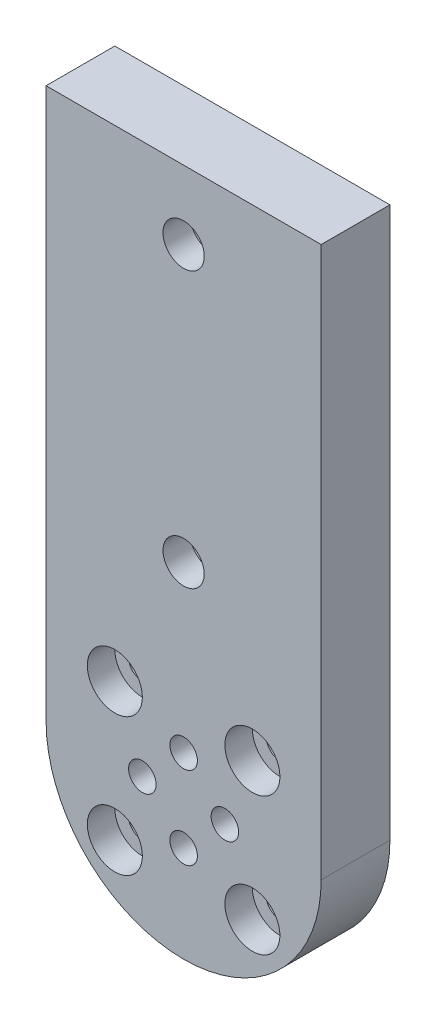
ISO-10303-21;
HEADER;
FILE_DESCRIPTION(('STEP AP214'),'2;1');
FILE_NAME('part.step','',(''),(''),'','','');
FILE_SCHEMA(('AUTOMOTIVE_DESIGN { 1 0 10303 214 1 1 1 1 }'));
ENDSEC;
DATA;
#1=APPLICATION_CONTEXT('core data for automotive mechanical design processes');
#2=APPLICATION_PROTOCOL_DEFINITION('international standard','automotive_design',2000,#1);
#3=PRODUCT_CONTEXT('',#1,'mechanical');
#4=PRODUCT('Part','Part','',(#3));
#5=PRODUCT_RELATED_PRODUCT_CATEGORY('part','',(#4));
#6=PRODUCT_DEFINITION_FORMATION('','',#4);
#7=PRODUCT_DEFINITION_CONTEXT('part definition',#1,'design');
#8=PRODUCT_DEFINITION('design','',#6,#7);
#9=PRODUCT_DEFINITION_SHAPE('','',#8);
#10=(LENGTH_UNIT() NAMED_UNIT(*) SI_UNIT(.MILLI.,.METRE.));
#11=(NAMED_UNIT(*) PLANE_ANGLE_UNIT() SI_UNIT($,.RADIAN.));
#12=(NAMED_UNIT(*) SI_UNIT($,.STERADIAN.) SOLID_ANGLE_UNIT());
#13=UNCERTAINTY_MEASURE_WITH_UNIT(LENGTH_MEASURE(1.E-05),#10,'distance_accuracy_value','');
#14=(GEOMETRIC_REPRESENTATION_CONTEXT(3) GLOBAL_UNCERTAINTY_ASSIGNED_CONTEXT((#13)) GLOBAL_UNIT_ASSIGNED_CONTEXT((#10,
#11,#12)) REPRESENTATION_CONTEXT('',''));
#15=CARTESIAN_POINT('',(0.,0.,0.));
#16=DIRECTION('',(0.,0.,1.));
#17=DIRECTION('',(1.,0.,0.));
#18=AXIS2_PLACEMENT_3D('',#15,#16,#17);
#19=CARTESIAN_POINT('',(0.,15.,5.));
#20=DIRECTION('',(0.,0.,-1.));
#21=DIRECTION('',(-1.,0.,0.));
#22=AXIS2_PLACEMENT_3D('',#19,#20,#21);
#23=CYLINDRICAL_SURFACE('',#22,1.5);
#24=CARTESIAN_POINT('',(0.,15.,5.));
#25=DIRECTION('',(0.,0.,1.));
#26=DIRECTION('',(1.,0.,0.));
#27=AXIS2_PLACEMENT_3D('',#24,#25,#26);
#28=CIRCLE('',#27,1.5);
#29=CARTESIAN_POINT('',(1.5,15.,5.));
#30=VERTEX_POINT('',#29);
#31=EDGE_CURVE('E105',#30,#30,#28,.T.);
#32=ORIENTED_EDGE('',*,*,#31,.T.);
#33=EDGE_LOOP('',(#32));
#34=FACE_BOUND('',#33,.T.);
#35=CARTESIAN_POINT('',(0.,15.,3.));
#36=DIRECTION('',(0.,0.,-1.));
#37=DIRECTION('',(-1.,0.,0.));
#38=AXIS2_PLACEMENT_3D('',#35,#36,#37);
#39=CIRCLE('',#38,1.5);
#40=CARTESIAN_POINT('',(-1.5,15.,3.));
#41=VERTEX_POINT('',#40);
#42=EDGE_CURVE('E44',#41,#41,#39,.T.);
#43=ORIENTED_EDGE('',*,*,#42,.T.);
#44=EDGE_LOOP('',(#43));
#45=FACE_BOUND('',#44,.T.);
#46=ADVANCED_FACE('F40',(#34,#45),#23,.F.);
#47=CARTESIAN_POINT('',(0.,35.,5.));
#48=DIRECTION('',(0.,0.,-1.));
#49=DIRECTION('',(-1.,0.,0.));
#50=AXIS2_PLACEMENT_3D('',#47,#48,#49);
#51=CYLINDRICAL_SURFACE('',#50,1.5);
#52=CARTESIAN_POINT('',(0.,35.,5.));
#53=DIRECTION('',(0.,0.,1.));
#54=DIRECTION('',(1.,0.,0.));
#55=AXIS2_PLACEMENT_3D('',#52,#53,#54);
#56=CIRCLE('',#55,1.5);
#57=CARTESIAN_POINT('',(1.5,35.,5.));
#58=VERTEX_POINT('',#57);
#59=EDGE_CURVE('E111',#58,#58,#56,.T.);
#60=ORIENTED_EDGE('',*,*,#59,.T.);
#61=EDGE_LOOP('',(#60));
#62=FACE_BOUND('',#61,.T.);
#63=CARTESIAN_POINT('',(0.,35.,3.));
#64=DIRECTION('',(0.,0.,-1.));
#65=DIRECTION('',(-1.,0.,0.));
#66=AXIS2_PLACEMENT_3D('',#63,#64,#65);
#67=CIRCLE('',#66,1.5);
#68=CARTESIAN_POINT('',(-1.5,35.,3.));
#69=VERTEX_POINT('',#68);
#70=EDGE_CURVE('E148',#69,#69,#67,.T.);
#71=ORIENTED_EDGE('',*,*,#70,.T.);
#72=EDGE_LOOP('',(#71));
#73=FACE_BOUND('',#72,.T.);
#74=ADVANCED_FACE('F234',(#62,#73),#51,.F.);
#75=CARTESIAN_POINT('',(-5.,5.,5.));
#76=DIRECTION('',(0.,0.,-1.));
#77=DIRECTION('',(-1.,0.,0.));
#78=AXIS2_PLACEMENT_3D('',#75,#76,#77);
#79=CYLINDRICAL_SURFACE('',#78,1.);
#80=CARTESIAN_POINT('',(-5.,5.,0.));
#81=DIRECTION('',(0.,0.,1.));
#82=DIRECTION('',(1.,0.,0.));
#83=AXIS2_PLACEMENT_3D('',#80,#81,#82);
#84=CIRCLE('',#83,1.);
#85=CARTESIAN_POINT('',(-4.,5.,0.));
#86=VERTEX_POINT('',#85);
#87=EDGE_CURVE('E124',#86,#86,#84,.T.);
#88=ORIENTED_EDGE('',*,*,#87,.F.);
#89=EDGE_LOOP('',(#88));
#90=FACE_BOUND('',#89,.T.);
#91=CARTESIAN_POINT('',(-5.,5.,3.));
#92=DIRECTION('',(0.,0.,1.));
#93=DIRECTION('',(1.,0.,0.));
#94=AXIS2_PLACEMENT_3D('',#91,#92,#93);
#95=CIRCLE('',#94,1.);
#96=CARTESIAN_POINT('',(-4.,5.,3.));
#97=VERTEX_POINT('',#96);
#98=EDGE_CURVE('E118',#97,#97,#95,.T.);
#99=ORIENTED_EDGE('',*,*,#98,.T.);
#100=EDGE_LOOP('',(#99));
#101=FACE_BOUND('',#100,.T.);
#102=ADVANCED_FACE('F240',(#90,#101),#79,.F.);
#103=CARTESIAN_POINT('',(5.,5.,5.));
#104=DIRECTION('',(0.,0.,-1.));
#105=DIRECTION('',(-1.,0.,0.));
#106=AXIS2_PLACEMENT_3D('',#103,#104,#105);
#107=CYLINDRICAL_SURFACE('',#106,1.);
#108=CARTESIAN_POINT('',(5.,5.,0.));
#109=DIRECTION('',(0.,0.,1.));
#110=DIRECTION('',(1.,0.,0.));
#111=AXIS2_PLACEMENT_3D('',#108,#109,#110);
#112=CIRCLE('',#111,1.);
#113=CARTESIAN_POINT('',(6.,5.,0.));
#114=VERTEX_POINT('',#113);
#115=EDGE_CURVE('E121',#114,#114,#112,.T.);
#116=ORIENTED_EDGE('',*,*,#115,.F.);
#117=EDGE_LOOP('',(#116));
#118=FACE_BOUND('',#117,.T.);
#119=CARTESIAN_POINT('',(5.,5.,3.));
#120=DIRECTION('',(0.,0.,1.));
#121=DIRECTION('',(1.,0.,0.));
#122=AXIS2_PLACEMENT_3D('',#119,#120,#121);
#123=CIRCLE('',#122,1.);
#124=CARTESIAN_POINT('',(6.,5.,3.));
#125=VERTEX_POINT('',#124);
#126=EDGE_CURVE('E144',#125,#125,#123,.T.);
#127=ORIENTED_EDGE('',*,*,#126,.T.);
#128=EDGE_LOOP('',(#127));
#129=FACE_BOUND('',#128,.T.);
#130=ADVANCED_FACE('F254',(#118,#129),#107,.F.);
#131=CARTESIAN_POINT('',(-5.,-5.,5.));
#132=DIRECTION('',(0.,0.,-1.));
#133=DIRECTION('',(-1.,0.,0.));
#134=AXIS2_PLACEMENT_3D('',#131,#132,#133);
#135=CYLINDRICAL_SURFACE('',#134,1.);
#136=CARTESIAN_POINT('',(-5.,-5.,0.));
#137=DIRECTION('',(0.,0.,1.));
#138=DIRECTION('',(1.,0.,0.));
#139=AXIS2_PLACEMENT_3D('',#136,#137,#138);
#140=CIRCLE('',#139,1.);
#141=CARTESIAN_POINT('',(-4.,-5.,0.));
#142=VERTEX_POINT('',#141);
#143=EDGE_CURVE('E117',#142,#142,#140,.T.);
#144=ORIENTED_EDGE('',*,*,#143,.F.);
#145=EDGE_LOOP('',(#144));
#146=FACE_BOUND('',#145,.T.);
#147=CARTESIAN_POINT('',(-5.,-5.,3.));
#148=DIRECTION('',(0.,0.,1.));
#149=DIRECTION('',(1.,0.,0.));
#150=AXIS2_PLACEMENT_3D('',#147,#148,#149);
#151=CIRCLE('',#150,1.);
#152=CARTESIAN_POINT('',(-4.,-5.,3.));
#153=VERTEX_POINT('',#152);
#154=EDGE_CURVE('E140',#153,#153,#151,.T.);
#155=ORIENTED_EDGE('',*,*,#154,.T.);
#156=EDGE_LOOP('',(#155));
#157=FACE_BOUND('',#156,.T.);
#158=ADVANCED_FACE('F257',(#146,#157),#135,.F.);
#159=CARTESIAN_POINT('',(5.,-5.,5.));
#160=DIRECTION('',(0.,0.,-1.));
#161=DIRECTION('',(-1.,0.,0.));
#162=AXIS2_PLACEMENT_3D('',#159,#160,#161);
#163=CYLINDRICAL_SURFACE('',#162,1.);
#164=CARTESIAN_POINT('',(5.,-5.,0.));
#165=DIRECTION('',(0.,0.,1.));
#166=DIRECTION('',(1.,0.,0.));
#167=AXIS2_PLACEMENT_3D('',#164,#165,#166);
#168=CIRCLE('',#167,1.);
#169=CARTESIAN_POINT('',(6.,-5.,0.));
#170=VERTEX_POINT('',#169);
#171=EDGE_CURVE('E114',#170,#170,#168,.T.);
#172=ORIENTED_EDGE('',*,*,#171,.F.);
#173=EDGE_LOOP('',(#172));
#174=FACE_BOUND('',#173,.T.);
#175=CARTESIAN_POINT('',(5.,-5.,3.));
#176=DIRECTION('',(0.,0.,1.));
#177=DIRECTION('',(1.,0.,0.));
#178=AXIS2_PLACEMENT_3D('',#175,#176,#177);
#179=CIRCLE('',#178,1.);
#180=CARTESIAN_POINT('',(6.,-5.,3.));
#181=VERTEX_POINT('',#180);
#182=EDGE_CURVE('E137',#181,#181,#179,.T.);
#183=ORIENTED_EDGE('',*,*,#182,.T.);
#184=EDGE_LOOP('',(#183));
#185=FACE_BOUND('',#184,.T.);
#186=ADVANCED_FACE('F42',(#174,#185),#163,.F.);
#187=CARTESIAN_POINT('',(0.,0.,5.));
#188=DIRECTION('',(0.,0.,-1.));
#189=DIRECTION('',(-1.,0.,0.));
#190=AXIS2_PLACEMENT_3D('',#187,#188,#189);
#191=CYLINDRICAL_SURFACE('',#190,10.);
#192=CARTESIAN_POINT('',(0.,0.,0.));
#193=DIRECTION('',(0.,0.,1.));
#194=DIRECTION('',(1.,0.,0.));
#195=AXIS2_PLACEMENT_3D('',#192,#193,#194);
#196=CIRCLE('',#195,10.);
#197=CARTESIAN_POINT('',(-10.,0.,0.));
#198=VERTEX_POINT('',#197);
#199=CARTESIAN_POINT('',(10.,0.,0.));
#200=VERTEX_POINT('',#199);
#201=EDGE_CURVE('E127',#198,#200,#196,.T.);
#202=ORIENTED_EDGE('',*,*,#201,.T.);
#203=DIRECTION('',(0.,0.,-1.));
#204=VECTOR('',#203,1.);
#205=CARTESIAN_POINT('',(10.,0.,5.));
#206=LINE('',#205,#204);
#207=CARTESIAN_POINT('',(10.,0.,5.));
#208=VERTEX_POINT('',#207);
#209=EDGE_CURVE('E11',#208,#200,#206,.T.);
#210=ORIENTED_EDGE('',*,*,#209,.F.);
#211=CARTESIAN_POINT('',(0.,0.,5.));
#212=DIRECTION('',(0.,0.,1.));
#213=DIRECTION('',(1.,0.,0.));
#214=AXIS2_PLACEMENT_3D('',#211,#212,#213);
#215=CIRCLE('',#214,10.);
#216=CARTESIAN_POINT('',(-10.,0.,5.));
#217=VERTEX_POINT('',#216);
#218=EDGE_CURVE('E93',#217,#208,#215,.T.);
#219=ORIENTED_EDGE('',*,*,#218,.F.);
#220=DIRECTION('',(0.,0.,-1.));
#221=VECTOR('',#220,1.);
#222=CARTESIAN_POINT('',(-10.,0.,5.));
#223=LINE('',#222,#221);
#224=EDGE_CURVE('E59',#217,#198,#223,.T.);
#225=ORIENTED_EDGE('',*,*,#224,.T.);
#226=EDGE_LOOP('',(#202,#210,#219,#225));
#227=FACE_BOUND('',#226,.T.);
#228=ADVANCED_FACE('F249',(#227),#191,.T.);
#229=CARTESIAN_POINT('',(10.,0.,5.));
#230=DIRECTION('',(-1.,0.,0.));
#231=DIRECTION('',(0.,0.,1.));
#232=AXIS2_PLACEMENT_3D('',#229,#230,#231);
#233=PLANE('',#232);
#234=DIRECTION('',(0.,1.,0.));
#235=VECTOR('',#234,1.);
#236=CARTESIAN_POINT('',(10.,0.,0.));
#237=LINE('',#236,#235);
#238=CARTESIAN_POINT('',(10.,40.,0.));
#239=VERTEX_POINT('',#238);
#240=EDGE_CURVE('E98',#200,#239,#237,.T.);
#241=ORIENTED_EDGE('',*,*,#240,.T.);
#242=DIRECTION('',(0.,0.,-1.));
#243=VECTOR('',#242,1.);
#244=CARTESIAN_POINT('',(10.,40.,5.));
#245=LINE('',#244,#243);
#246=CARTESIAN_POINT('',(10.,40.,5.));
#247=VERTEX_POINT('',#246);
#248=EDGE_CURVE('E50',#247,#239,#245,.T.);
#249=ORIENTED_EDGE('',*,*,#248,.F.);
#250=DIRECTION('',(0.,1.,0.));
#251=VECTOR('',#250,1.);
#252=CARTESIAN_POINT('',(10.,0.,5.));
#253=LINE('',#252,#251);
#254=EDGE_CURVE('E84',#208,#247,#253,.T.);
#255=ORIENTED_EDGE('',*,*,#254,.F.);
#256=ORIENTED_EDGE('',*,*,#209,.T.);
#257=EDGE_LOOP('',(#241,#249,#255,#256));
#258=FACE_BOUND('',#257,.T.);
#259=ADVANCED_FACE('F97',(#258),#233,.F.);
#260=CARTESIAN_POINT('',(0.,40.,5.));
#261=DIRECTION('',(0.,1.,0.));
#262=DIRECTION('',(0.,0.,1.));
#263=AXIS2_PLACEMENT_3D('',#260,#261,#262);
#264=PLANE('',#263);
#265=DIRECTION('',(1.,0.,0.));
#266=VECTOR('',#265,1.);
#267=CARTESIAN_POINT('',(0.,40.,0.));
#268=LINE('',#267,#266);
#269=CARTESIAN_POINT('',(-10.,40.,0.));
#270=VERTEX_POINT('',#269);
#271=EDGE_CURVE('E130',#270,#239,#268,.T.);
#272=ORIENTED_EDGE('',*,*,#271,.F.);
#273=DIRECTION('',(0.,0.,-1.));
#274=VECTOR('',#273,1.);
#275=CARTESIAN_POINT('',(-10.,40.,5.));
#276=LINE('',#275,#274);
#277=CARTESIAN_POINT('',(-10.,40.,5.));
#278=VERTEX_POINT('',#277);
#279=EDGE_CURVE('E73',#278,#270,#276,.T.);
#280=ORIENTED_EDGE('',*,*,#279,.F.);
#281=DIRECTION('',(1.,0.,0.));
#282=VECTOR('',#281,1.);
#283=CARTESIAN_POINT('',(0.,40.,5.));
#284=LINE('',#283,#282);
#285=EDGE_CURVE('E92',#278,#247,#284,.T.);
#286=ORIENTED_EDGE('',*,*,#285,.T.);
#287=ORIENTED_EDGE('',*,*,#248,.T.);
#288=EDGE_LOOP('',(#272,#280,#286,#287));
#289=FACE_BOUND('',#288,.T.);
#290=ADVANCED_FACE('F102',(#289),#264,.T.);
#291=CARTESIAN_POINT('',(-10.,0.,5.));
#292=DIRECTION('',(-1.,0.,0.));
#293=DIRECTION('',(0.,0.,1.));
#294=AXIS2_PLACEMENT_3D('',#291,#292,#293);
#295=PLANE('',#294);
#296=DIRECTION('',(0.,1.,0.));
#297=VECTOR('',#296,1.);
#298=CARTESIAN_POINT('',(-10.,0.,0.));
#299=LINE('',#298,#297);
#300=EDGE_CURVE('E132',#198,#270,#299,.T.);
#301=ORIENTED_EDGE('',*,*,#300,.F.);
#302=ORIENTED_EDGE('',*,*,#224,.F.);
#303=DIRECTION('',(0.,1.,0.));
#304=VECTOR('',#303,1.);
#305=CARTESIAN_POINT('',(-10.,0.,5.));
#306=LINE('',#305,#304);
#307=EDGE_CURVE('E103',#217,#278,#306,.T.);
#308=ORIENTED_EDGE('',*,*,#307,.T.);
#309=ORIENTED_EDGE('',*,*,#279,.T.);
#310=EDGE_LOOP('',(#301,#302,#308,#309));
#311=FACE_BOUND('',#310,.T.);
#312=ADVANCED_FACE('F220',(#311),#295,.T.);
#313=CARTESIAN_POINT('',(0.,0.,5.));
#314=DIRECTION('',(0.,0.,1.));
#315=DIRECTION('',(1.,0.,0.));
#316=AXIS2_PLACEMENT_3D('',#313,#314,#315);
#317=PLANE('',#316);
#318=CARTESIAN_POINT('',(5.,5.,5.));
#319=DIRECTION('',(0.,0.,1.));
#320=DIRECTION('',(1.,0.,0.));
#321=AXIS2_PLACEMENT_3D('',#318,#319,#320);
#322=CIRCLE('',#321,2.);
#323=CARTESIAN_POINT('',(7.,5.,5.));
#324=VERTEX_POINT('',#323);
#325=EDGE_CURVE('E187',#324,#324,#322,.T.);
#326=ORIENTED_EDGE('',*,*,#325,.F.);
#327=EDGE_LOOP('',(#326));
#328=FACE_BOUND('',#327,.T.);
#329=CARTESIAN_POINT('',(5.,-5.,5.));
#330=DIRECTION('',(0.,0.,1.));
#331=DIRECTION('',(1.,0.,0.));
#332=AXIS2_PLACEMENT_3D('',#329,#330,#331);
#333=CIRCLE('',#332,2.);
#334=CARTESIAN_POINT('',(7.,-5.,5.));
#335=VERTEX_POINT('',#334);
#336=EDGE_CURVE('E194',#335,#335,#333,.T.);
#337=ORIENTED_EDGE('',*,*,#336,.F.);
#338=EDGE_LOOP('',(#337));
#339=FACE_BOUND('',#338,.T.);
#340=CARTESIAN_POINT('',(-5.,-5.,5.));
#341=DIRECTION('',(0.,0.,1.));
#342=DIRECTION('',(1.,0.,0.));
#343=AXIS2_PLACEMENT_3D('',#340,#341,#342);
#344=CIRCLE('',#343,2.);
#345=CARTESIAN_POINT('',(-3.,-5.,5.));
#346=VERTEX_POINT('',#345);
#347=EDGE_CURVE('E200',#346,#346,#344,.T.);
#348=ORIENTED_EDGE('',*,*,#347,.F.);
#349=EDGE_LOOP('',(#348));
#350=FACE_BOUND('',#349,.T.);
#351=CARTESIAN_POINT('',(0.,3.,5.));
#352=DIRECTION('',(0.,0.,1.));
#353=DIRECTION('',(1.,0.,0.));
#354=AXIS2_PLACEMENT_3D('',#351,#352,#353);
#355=CIRCLE('',#354,1.);
#356=CARTESIAN_POINT('',(1.,3.,5.));
#357=VERTEX_POINT('',#356);
#358=EDGE_CURVE('E206',#357,#357,#355,.T.);
#359=ORIENTED_EDGE('',*,*,#358,.F.);
#360=EDGE_LOOP('',(#359));
#361=FACE_BOUND('',#360,.T.);
#362=CARTESIAN_POINT('',(-3.,0.,5.));
#363=DIRECTION('',(0.,0.,1.));
#364=DIRECTION('',(1.,0.,0.));
#365=AXIS2_PLACEMENT_3D('',#362,#363,#364);
#366=CIRCLE('',#365,1.);
#367=CARTESIAN_POINT('',(-2.,0.,5.));
#368=VERTEX_POINT('',#367);
#369=EDGE_CURVE('E169',#368,#368,#366,.T.);
#370=ORIENTED_EDGE('',*,*,#369,.F.);
#371=EDGE_LOOP('',(#370));
#372=FACE_BOUND('',#371,.T.);
#373=CARTESIAN_POINT('',(3.,0.,5.));
#374=DIRECTION('',(0.,0.,1.));
#375=DIRECTION('',(1.,0.,0.));
#376=AXIS2_PLACEMENT_3D('',#373,#374,#375);
#377=CIRCLE('',#376,1.);
#378=CARTESIAN_POINT('',(4.,0.,5.));
#379=VERTEX_POINT('',#378);
#380=EDGE_CURVE('E176',#379,#379,#377,.T.);
#381=ORIENTED_EDGE('',*,*,#380,.F.);
#382=EDGE_LOOP('',(#381));
#383=FACE_BOUND('',#382,.T.);
#384=CARTESIAN_POINT('',(0.,-3.,5.));
#385=DIRECTION('',(0.,0.,1.));
#386=DIRECTION('',(1.,0.,0.));
#387=AXIS2_PLACEMENT_3D('',#384,#385,#386);
#388=CIRCLE('',#387,1.);
#389=CARTESIAN_POINT('',(1.,-3.,5.));
#390=VERTEX_POINT('',#389);
#391=EDGE_CURVE('E182',#390,#390,#388,.T.);
#392=ORIENTED_EDGE('',*,*,#391,.F.);
#393=EDGE_LOOP('',(#392));
#394=FACE_BOUND('',#393,.T.);
#395=CARTESIAN_POINT('',(-5.,5.,5.));
#396=DIRECTION('',(0.,0.,1.));
#397=DIRECTION('',(1.,0.,0.));
#398=AXIS2_PLACEMENT_3D('',#395,#396,#397);
#399=CIRCLE('',#398,2.);
#400=CARTESIAN_POINT('',(-3.,5.,5.));
#401=VERTEX_POINT('',#400);
#402=EDGE_CURVE('E190',#401,#401,#399,.T.);
#403=ORIENTED_EDGE('',*,*,#402,.F.);
#404=EDGE_LOOP('',(#403));
#405=FACE_BOUND('',#404,.T.);
#406=ORIENTED_EDGE('',*,*,#218,.T.);
#407=ORIENTED_EDGE('',*,*,#254,.T.);
#408=ORIENTED_EDGE('',*,*,#285,.F.);
#409=ORIENTED_EDGE('',*,*,#307,.F.);
#410=EDGE_LOOP('',(#406,#407,#408,#409));
#411=FACE_BOUND('',#410,.T.);
#412=ORIENTED_EDGE('',*,*,#31,.F.);
#413=EDGE_LOOP('',(#412));
#414=FACE_BOUND('',#413,.T.);
#415=ORIENTED_EDGE('',*,*,#59,.F.);
#416=EDGE_LOOP('',(#415));
#417=FACE_BOUND('',#416,.T.);
#418=ADVANCED_FACE('F88',(#328,#339,#350,#361,#372,#383,#394,#405,#411,#414,#417),#317,.T.);
#419=CARTESIAN_POINT('',(0.,0.,0.));
#420=DIRECTION('',(0.,0.,1.));
#421=DIRECTION('',(1.,0.,0.));
#422=AXIS2_PLACEMENT_3D('',#419,#420,#421);
#423=PLANE('',#422);
#424=CARTESIAN_POINT('',(0.,35.,0.));
#425=DIRECTION('',(0.,0.,-1.));
#426=DIRECTION('',(-1.,0.,0.));
#427=AXIS2_PLACEMENT_3D('',#424,#425,#426);
#428=CIRCLE('',#427,3.5);
#429=CARTESIAN_POINT('',(-3.5,35.,0.));
#430=VERTEX_POINT('',#429);
#431=EDGE_CURVE('E156',#430,#430,#428,.T.);
#432=ORIENTED_EDGE('',*,*,#431,.F.);
#433=EDGE_LOOP('',(#432));
#434=FACE_BOUND('',#433,.T.);
#435=CARTESIAN_POINT('',(0.,15.,0.));
#436=DIRECTION('',(0.,0.,-1.));
#437=DIRECTION('',(-1.,0.,0.));
#438=AXIS2_PLACEMENT_3D('',#435,#436,#437);
#439=CIRCLE('',#438,3.5);
#440=CARTESIAN_POINT('',(-3.5,15.,0.));
#441=VERTEX_POINT('',#440);
#442=EDGE_CURVE('E161',#441,#441,#439,.T.);
#443=ORIENTED_EDGE('',*,*,#442,.F.);
#444=EDGE_LOOP('',(#443));
#445=FACE_BOUND('',#444,.T.);
#446=ORIENTED_EDGE('',*,*,#171,.T.);
#447=EDGE_LOOP('',(#446));
#448=FACE_BOUND('',#447,.T.);
#449=ORIENTED_EDGE('',*,*,#143,.T.);
#450=EDGE_LOOP('',(#449));
#451=FACE_BOUND('',#450,.T.);
#452=ORIENTED_EDGE('',*,*,#115,.T.);
#453=EDGE_LOOP('',(#452));
#454=FACE_BOUND('',#453,.T.);
#455=ORIENTED_EDGE('',*,*,#87,.T.);
#456=EDGE_LOOP('',(#455));
#457=FACE_BOUND('',#456,.T.);
#458=ORIENTED_EDGE('',*,*,#201,.F.);
#459=ORIENTED_EDGE('',*,*,#300,.T.);
#460=ORIENTED_EDGE('',*,*,#271,.T.);
#461=ORIENTED_EDGE('',*,*,#240,.F.);
#462=EDGE_LOOP('',(#458,#459,#460,#461));
#463=FACE_BOUND('',#462,.T.);
#464=ADVANCED_FACE('F219',(#434,#445,#448,#451,#454,#457,#463),#423,.F.);
#465=CARTESIAN_POINT('',(-5.,5.,3.));
#466=DIRECTION('',(0.,0.,1.));
#467=DIRECTION('',(1.,0.,0.));
#468=AXIS2_PLACEMENT_3D('',#465,#466,#467);
#469=CYLINDRICAL_SURFACE('',#468,2.);
#470=CARTESIAN_POINT('',(-5.,5.,3.));
#471=DIRECTION('',(0.,0.,1.));
#472=DIRECTION('',(1.,0.,0.));
#473=AXIS2_PLACEMENT_3D('',#470,#471,#472);
#474=CIRCLE('',#473,2.);
#475=CARTESIAN_POINT('',(-3.,5.,3.));
#476=VERTEX_POINT('',#475);
#477=EDGE_CURVE('E141',#476,#476,#474,.T.);
#478=ORIENTED_EDGE('',*,*,#477,.F.);
#479=EDGE_LOOP('',(#478));
#480=FACE_BOUND('',#479,.T.);
#481=ORIENTED_EDGE('',*,*,#402,.T.);
#482=EDGE_LOOP('',(#481));
#483=FACE_BOUND('',#482,.T.);
#484=ADVANCED_FACE('F216',(#480,#483),#469,.F.);
#485=CARTESIAN_POINT('',(-5.,5.,3.));
#486=DIRECTION('',(0.,0.,1.));
#487=DIRECTION('',(1.,0.,0.));
#488=AXIS2_PLACEMENT_3D('',#485,#486,#487);
#489=PLANE('',#488);
#490=ORIENTED_EDGE('',*,*,#98,.F.);
#491=EDGE_LOOP('',(#490));
#492=FACE_BOUND('',#491,.T.);
#493=ORIENTED_EDGE('',*,*,#477,.T.);
#494=EDGE_LOOP('',(#493));
#495=FACE_BOUND('',#494,.T.);
#496=ADVANCED_FACE('F295',(#492,#495),#489,.T.);
#497=CARTESIAN_POINT('',(0.,-3.,3.));
#498=DIRECTION('',(0.,0.,1.));
#499=DIRECTION('',(1.,0.,0.));
#500=AXIS2_PLACEMENT_3D('',#497,#498,#499);
#501=CYLINDRICAL_SURFACE('',#500,1.);
#502=CARTESIAN_POINT('',(0.,-3.,3.));
#503=DIRECTION('',(0.,0.,1.));
#504=DIRECTION('',(1.,0.,0.));
#505=AXIS2_PLACEMENT_3D('',#502,#503,#504);
#506=CIRCLE('',#505,1.);
#507=CARTESIAN_POINT('',(1.,-3.,3.));
#508=VERTEX_POINT('',#507);
#509=EDGE_CURVE('E154',#508,#508,#506,.T.);
#510=ORIENTED_EDGE('',*,*,#509,.F.);
#511=EDGE_LOOP('',(#510));
#512=FACE_BOUND('',#511,.T.);
#513=ORIENTED_EDGE('',*,*,#391,.T.);
#514=EDGE_LOOP('',(#513));
#515=FACE_BOUND('',#514,.T.);
#516=ADVANCED_FACE('F292',(#512,#515),#501,.F.);
#517=CARTESIAN_POINT('',(0.,-3.,3.));
#518=DIRECTION('',(0.,0.,1.));
#519=DIRECTION('',(1.,0.,0.));
#520=AXIS2_PLACEMENT_3D('',#517,#518,#519);
#521=PLANE('',#520);
#522=ORIENTED_EDGE('',*,*,#509,.T.);
#523=EDGE_LOOP('',(#522));
#524=FACE_BOUND('',#523,.T.);
#525=ADVANCED_FACE('F294',(#524),#521,.T.);
#526=CARTESIAN_POINT('',(3.,0.,3.));
#527=DIRECTION('',(0.,0.,1.));
#528=DIRECTION('',(1.,0.,0.));
#529=AXIS2_PLACEMENT_3D('',#526,#527,#528);
#530=CYLINDRICAL_SURFACE('',#529,1.);
#531=CARTESIAN_POINT('',(3.,0.,3.));
#532=DIRECTION('',(0.,0.,1.));
#533=DIRECTION('',(1.,0.,0.));
#534=AXIS2_PLACEMENT_3D('',#531,#532,#533);
#535=CIRCLE('',#534,1.);
#536=CARTESIAN_POINT('',(4.,0.,3.));
#537=VERTEX_POINT('',#536);
#538=EDGE_CURVE('E179',#537,#537,#535,.T.);
#539=ORIENTED_EDGE('',*,*,#538,.F.);
#540=EDGE_LOOP('',(#539));
#541=FACE_BOUND('',#540,.T.);
#542=ORIENTED_EDGE('',*,*,#380,.T.);
#543=EDGE_LOOP('',(#542));
#544=FACE_BOUND('',#543,.T.);
#545=ADVANCED_FACE('F302',(#541,#544),#530,.F.);
#546=CARTESIAN_POINT('',(3.,0.,3.));
#547=DIRECTION('',(0.,0.,1.));
#548=DIRECTION('',(1.,0.,0.));
#549=AXIS2_PLACEMENT_3D('',#546,#547,#548);
#550=PLANE('',#549);
#551=ORIENTED_EDGE('',*,*,#538,.T.);
#552=EDGE_LOOP('',(#551));
#553=FACE_BOUND('',#552,.T.);
#554=ADVANCED_FACE('F309',(#553),#550,.T.);
#555=CARTESIAN_POINT('',(-3.,0.,3.));
#556=DIRECTION('',(0.,0.,1.));
#557=DIRECTION('',(1.,0.,0.));
#558=AXIS2_PLACEMENT_3D('',#555,#556,#557);
#559=CYLINDRICAL_SURFACE('',#558,1.);
#560=CARTESIAN_POINT('',(-3.,0.,3.));
#561=DIRECTION('',(0.,0.,1.));
#562=DIRECTION('',(1.,0.,0.));
#563=AXIS2_PLACEMENT_3D('',#560,#561,#562);
#564=CIRCLE('',#563,1.);
#565=CARTESIAN_POINT('',(-2.,0.,3.));
#566=VERTEX_POINT('',#565);
#567=EDGE_CURVE('E173',#566,#566,#564,.T.);
#568=ORIENTED_EDGE('',*,*,#567,.F.);
#569=EDGE_LOOP('',(#568));
#570=FACE_BOUND('',#569,.T.);
#571=ORIENTED_EDGE('',*,*,#369,.T.);
#572=EDGE_LOOP('',(#571));
#573=FACE_BOUND('',#572,.T.);
#574=ADVANCED_FACE('F378',(#570,#573),#559,.F.);
#575=CARTESIAN_POINT('',(-3.,0.,3.));
#576=DIRECTION('',(0.,0.,1.));
#577=DIRECTION('',(1.,0.,0.));
#578=AXIS2_PLACEMENT_3D('',#575,#576,#577);
#579=PLANE('',#578);
#580=ORIENTED_EDGE('',*,*,#567,.T.);
#581=EDGE_LOOP('',(#580));
#582=FACE_BOUND('',#581,.T.);
#583=ADVANCED_FACE('F331',(#582),#579,.T.);
#584=CARTESIAN_POINT('',(0.,3.,3.));
#585=DIRECTION('',(0.,0.,1.));
#586=DIRECTION('',(1.,0.,0.));
#587=AXIS2_PLACEMENT_3D('',#584,#585,#586);
#588=CYLINDRICAL_SURFACE('',#587,1.);
#589=CARTESIAN_POINT('',(0.,3.,3.));
#590=DIRECTION('',(0.,0.,1.));
#591=DIRECTION('',(1.,0.,0.));
#592=AXIS2_PLACEMENT_3D('',#589,#590,#591);
#593=CIRCLE('',#592,1.);
#594=CARTESIAN_POINT('',(1.,3.,3.));
#595=VERTEX_POINT('',#594);
#596=EDGE_CURVE('E172',#595,#595,#593,.T.);
#597=ORIENTED_EDGE('',*,*,#596,.F.);
#598=EDGE_LOOP('',(#597));
#599=FACE_BOUND('',#598,.T.);
#600=ORIENTED_EDGE('',*,*,#358,.T.);
#601=EDGE_LOOP('',(#600));
#602=FACE_BOUND('',#601,.T.);
#603=ADVANCED_FACE('F328',(#599,#602),#588,.F.);
#604=CARTESIAN_POINT('',(0.,3.,3.));
#605=DIRECTION('',(0.,0.,1.));
#606=DIRECTION('',(1.,0.,0.));
#607=AXIS2_PLACEMENT_3D('',#604,#605,#606);
#608=PLANE('',#607);
#609=ORIENTED_EDGE('',*,*,#596,.T.);
#610=EDGE_LOOP('',(#609));
#611=FACE_BOUND('',#610,.T.);
#612=ADVANCED_FACE('F279',(#611),#608,.T.);
#613=CARTESIAN_POINT('',(-5.,-5.,3.));
#614=DIRECTION('',(0.,0.,1.));
#615=DIRECTION('',(1.,0.,0.));
#616=AXIS2_PLACEMENT_3D('',#613,#614,#615);
#617=CYLINDRICAL_SURFACE('',#616,2.);
#618=CARTESIAN_POINT('',(-5.,-5.,3.));
#619=DIRECTION('',(0.,0.,1.));
#620=DIRECTION('',(1.,0.,0.));
#621=AXIS2_PLACEMENT_3D('',#618,#619,#620);
#622=CIRCLE('',#621,2.);
#623=CARTESIAN_POINT('',(-3.,-5.,3.));
#624=VERTEX_POINT('',#623);
#625=EDGE_CURVE('E203',#624,#624,#622,.T.);
#626=ORIENTED_EDGE('',*,*,#625,.F.);
#627=EDGE_LOOP('',(#626));
#628=FACE_BOUND('',#627,.T.);
#629=ORIENTED_EDGE('',*,*,#347,.T.);
#630=EDGE_LOOP('',(#629));
#631=FACE_BOUND('',#630,.T.);
#632=ADVANCED_FACE('F273',(#628,#631),#617,.F.);
#633=CARTESIAN_POINT('',(-5.,-5.,3.));
#634=DIRECTION('',(0.,0.,1.));
#635=DIRECTION('',(1.,0.,0.));
#636=AXIS2_PLACEMENT_3D('',#633,#634,#635);
#637=PLANE('',#636);
#638=ORIENTED_EDGE('',*,*,#154,.F.);
#639=EDGE_LOOP('',(#638));
#640=FACE_BOUND('',#639,.T.);
#641=ORIENTED_EDGE('',*,*,#625,.T.);
#642=EDGE_LOOP('',(#641));
#643=FACE_BOUND('',#642,.T.);
#644=ADVANCED_FACE('F269',(#640,#643),#637,.T.);
#645=CARTESIAN_POINT('',(5.,-5.,3.));
#646=DIRECTION('',(0.,0.,1.));
#647=DIRECTION('',(1.,0.,0.));
#648=AXIS2_PLACEMENT_3D('',#645,#646,#647);
#649=CYLINDRICAL_SURFACE('',#648,2.);
#650=CARTESIAN_POINT('',(5.,-5.,3.));
#651=DIRECTION('',(0.,0.,1.));
#652=DIRECTION('',(1.,0.,0.));
#653=AXIS2_PLACEMENT_3D('',#650,#651,#652);
#654=CIRCLE('',#653,2.);
#655=CARTESIAN_POINT('',(7.,-5.,3.));
#656=VERTEX_POINT('',#655);
#657=EDGE_CURVE('E197',#656,#656,#654,.T.);
#658=ORIENTED_EDGE('',*,*,#657,.F.);
#659=EDGE_LOOP('',(#658));
#660=FACE_BOUND('',#659,.T.);
#661=ORIENTED_EDGE('',*,*,#336,.T.);
#662=EDGE_LOOP('',(#661));
#663=FACE_BOUND('',#662,.T.);
#664=ADVANCED_FACE('F272',(#660,#663),#649,.F.);
#665=CARTESIAN_POINT('',(5.,-5.,3.));
#666=DIRECTION('',(0.,0.,1.));
#667=DIRECTION('',(1.,0.,0.));
#668=AXIS2_PLACEMENT_3D('',#665,#666,#667);
#669=PLANE('',#668);
#670=ORIENTED_EDGE('',*,*,#182,.F.);
#671=EDGE_LOOP('',(#670));
#672=FACE_BOUND('',#671,.T.);
#673=ORIENTED_EDGE('',*,*,#657,.T.);
#674=EDGE_LOOP('',(#673));
#675=FACE_BOUND('',#674,.T.);
#676=ADVANCED_FACE('F316',(#672,#675),#669,.T.);
#677=CARTESIAN_POINT('',(5.,5.,3.));
#678=DIRECTION('',(0.,0.,1.));
#679=DIRECTION('',(1.,0.,0.));
#680=AXIS2_PLACEMENT_3D('',#677,#678,#679);
#681=CYLINDRICAL_SURFACE('',#680,2.);
#682=CARTESIAN_POINT('',(5.,5.,3.));
#683=DIRECTION('',(0.,0.,1.));
#684=DIRECTION('',(1.,0.,0.));
#685=AXIS2_PLACEMENT_3D('',#682,#683,#684);
#686=CIRCLE('',#685,2.);
#687=CARTESIAN_POINT('',(7.,5.,3.));
#688=VERTEX_POINT('',#687);
#689=EDGE_CURVE('E191',#688,#688,#686,.T.);
#690=ORIENTED_EDGE('',*,*,#689,.F.);
#691=EDGE_LOOP('',(#690));
#692=FACE_BOUND('',#691,.T.);
#693=ORIENTED_EDGE('',*,*,#325,.T.);
#694=EDGE_LOOP('',(#693));
#695=FACE_BOUND('',#694,.T.);
#696=ADVANCED_FACE('F312',(#692,#695),#681,.F.);
#697=CARTESIAN_POINT('',(5.,5.,3.));
#698=DIRECTION('',(0.,0.,1.));
#699=DIRECTION('',(1.,0.,0.));
#700=AXIS2_PLACEMENT_3D('',#697,#698,#699);
#701=PLANE('',#700);
#702=ORIENTED_EDGE('',*,*,#126,.F.);
#703=EDGE_LOOP('',(#702));
#704=FACE_BOUND('',#703,.T.);
#705=ORIENTED_EDGE('',*,*,#689,.T.);
#706=EDGE_LOOP('',(#705));
#707=FACE_BOUND('',#706,.T.);
#708=ADVANCED_FACE('F315',(#704,#707),#701,.T.);
#709=CARTESIAN_POINT('',(0.,15.,3.));
#710=DIRECTION('',(0.,0.,-1.));
#711=DIRECTION('',(-1.,0.,0.));
#712=AXIS2_PLACEMENT_3D('',#709,#710,#711);
#713=CYLINDRICAL_SURFACE('',#712,3.5);
#714=CARTESIAN_POINT('',(0.,15.,3.));
#715=DIRECTION('',(0.,0.,-1.));
#716=DIRECTION('',(-1.,0.,0.));
#717=AXIS2_PLACEMENT_3D('',#714,#715,#716);
#718=CIRCLE('',#717,3.5);
#719=CARTESIAN_POINT('',(-3.5,15.,3.));
#720=VERTEX_POINT('',#719);
#721=EDGE_CURVE('E166',#720,#720,#718,.T.);
#722=ORIENTED_EDGE('',*,*,#721,.F.);
#723=EDGE_LOOP('',(#722));
#724=FACE_BOUND('',#723,.T.);
#725=ORIENTED_EDGE('',*,*,#442,.T.);
#726=EDGE_LOOP('',(#725));
#727=FACE_BOUND('',#726,.T.);
#728=ADVANCED_FACE('F320',(#724,#727),#713,.F.);
#729=CARTESIAN_POINT('',(0.,15.,3.));
#730=DIRECTION('',(0.,0.,-1.));
#731=DIRECTION('',(-1.,0.,0.));
#732=AXIS2_PLACEMENT_3D('',#729,#730,#731);
#733=PLANE('',#732);
#734=ORIENTED_EDGE('',*,*,#42,.F.);
#735=EDGE_LOOP('',(#734));
#736=FACE_BOUND('',#735,.T.);
#737=ORIENTED_EDGE('',*,*,#721,.T.);
#738=EDGE_LOOP('',(#737));
#739=FACE_BOUND('',#738,.T.);
#740=ADVANCED_FACE('F481',(#736,#739),#733,.T.);
#741=CARTESIAN_POINT('',(0.,35.,3.));
#742=DIRECTION('',(0.,0.,-1.));
#743=DIRECTION('',(-1.,0.,0.));
#744=AXIS2_PLACEMENT_3D('',#741,#742,#743);
#745=CYLINDRICAL_SURFACE('',#744,3.5);
#746=CARTESIAN_POINT('',(0.,35.,3.));
#747=DIRECTION('',(0.,0.,-1.));
#748=DIRECTION('',(-1.,0.,0.));
#749=AXIS2_PLACEMENT_3D('',#746,#747,#748);
#750=CIRCLE('',#749,3.5);
#751=CARTESIAN_POINT('',(-3.5,35.,3.));
#752=VERTEX_POINT('',#751);
#753=EDGE_CURVE('E150',#752,#752,#750,.T.);
#754=ORIENTED_EDGE('',*,*,#753,.F.);
#755=EDGE_LOOP('',(#754));
#756=FACE_BOUND('',#755,.T.);
#757=ORIENTED_EDGE('',*,*,#431,.T.);
#758=EDGE_LOOP('',(#757));
#759=FACE_BOUND('',#758,.T.);
#760=ADVANCED_FACE('F491',(#756,#759),#745,.F.);
#761=CARTESIAN_POINT('',(0.,35.,3.));
#762=DIRECTION('',(0.,0.,-1.));
#763=DIRECTION('',(-1.,0.,0.));
#764=AXIS2_PLACEMENT_3D('',#761,#762,#763);
#765=PLANE('',#764);
#766=ORIENTED_EDGE('',*,*,#70,.F.);
#767=EDGE_LOOP('',(#766));
#768=FACE_BOUND('',#767,.T.);
#769=ORIENTED_EDGE('',*,*,#753,.T.);
#770=EDGE_LOOP('',(#769));
#771=FACE_BOUND('',#770,.T.);
#772=ADVANCED_FACE('F502',(#768,#771),#765,.T.);
#773=CLOSED_SHELL('',(#46,#74,#102,#130,#158,#186,#228,#259,#290,#312,#418,#464,#484,#496,#516,
#525,#545,#554,#574,#583,#603,#612,#632,#644,#664,#676,#696,#708,#728,#740,#760,#772));
#774=MANIFOLD_SOLID_BREP('B2',#773);
#775=ADVANCED_BREP_SHAPE_REPRESENTATION('',(#18,#774),#14);
#776=SHAPE_DEFINITION_REPRESENTATION(#9,#775);
ENDSEC;
END-ISO-10303-21;
